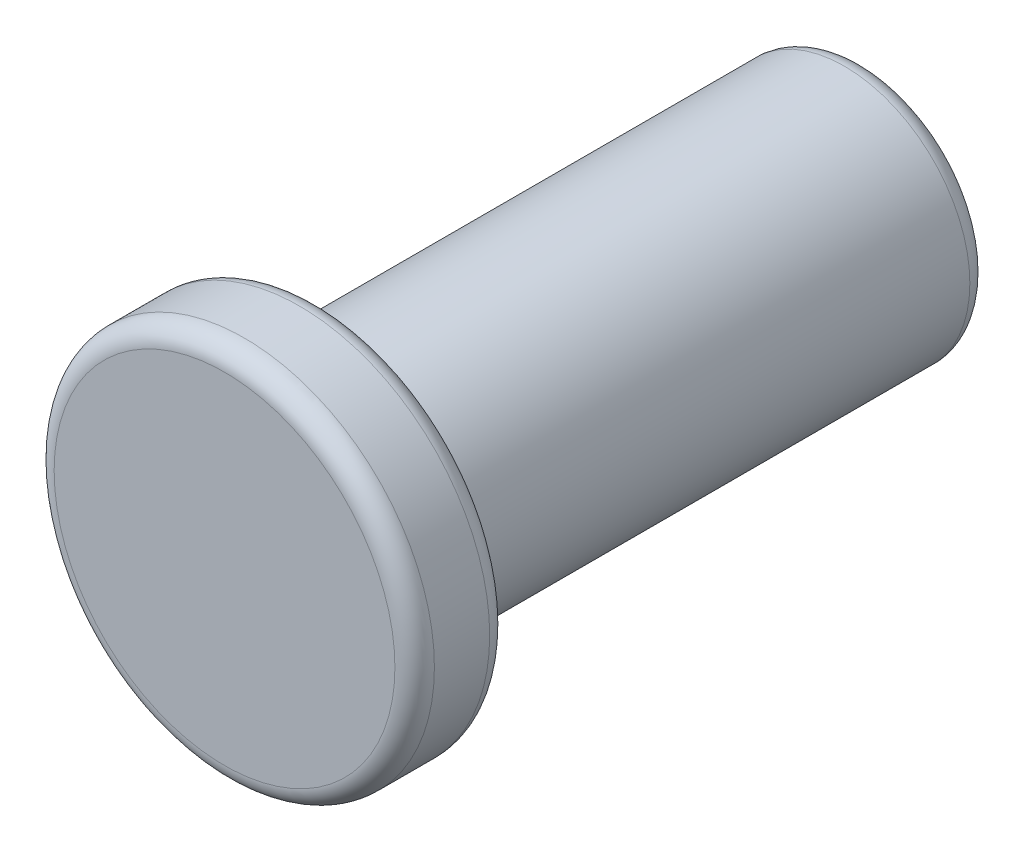
ISO-10303-21;
HEADER;
FILE_DESCRIPTION(('STEP AP214'),'2;1');
FILE_NAME('part.step','',(''),(''),'','','');
FILE_SCHEMA(('AUTOMOTIVE_DESIGN { 1 0 10303 214 1 1 1 1 }'));
ENDSEC;
DATA;
#1=APPLICATION_CONTEXT('core data for automotive mechanical design processes');
#2=APPLICATION_PROTOCOL_DEFINITION('international standard','automotive_design',2000,#1);
#3=PRODUCT_CONTEXT('',#1,'mechanical');
#4=PRODUCT('Part','Part','',(#3));
#5=PRODUCT_RELATED_PRODUCT_CATEGORY('part','',(#4));
#6=PRODUCT_DEFINITION_FORMATION('','',#4);
#7=PRODUCT_DEFINITION_CONTEXT('part definition',#1,'design');
#8=PRODUCT_DEFINITION('design','',#6,#7);
#9=PRODUCT_DEFINITION_SHAPE('','',#8);
#10=(LENGTH_UNIT() NAMED_UNIT(*) SI_UNIT(.MILLI.,.METRE.));
#11=(NAMED_UNIT(*) PLANE_ANGLE_UNIT() SI_UNIT($,.RADIAN.));
#12=(NAMED_UNIT(*) SI_UNIT($,.STERADIAN.) SOLID_ANGLE_UNIT());
#13=UNCERTAINTY_MEASURE_WITH_UNIT(LENGTH_MEASURE(1.E-05),#10,'distance_accuracy_value','');
#14=(GEOMETRIC_REPRESENTATION_CONTEXT(3) GLOBAL_UNCERTAINTY_ASSIGNED_CONTEXT((#13)) GLOBAL_UNIT_ASSIGNED_CONTEXT((#10,
#11,#12)) REPRESENTATION_CONTEXT('',''));
#15=CARTESIAN_POINT('',(0.,0.,0.));
#16=DIRECTION('',(0.,0.,1.));
#17=DIRECTION('',(1.,0.,0.));
#18=AXIS2_PLACEMENT_3D('',#15,#16,#17);
#19=CARTESIAN_POINT('',(0.,0.,0.));
#20=DIRECTION('',(0.,0.,1.));
#21=DIRECTION('',(1.,0.,0.));
#22=AXIS2_PLACEMENT_3D('',#19,#20,#21);
#23=PLANE('',#22);
#24=CARTESIAN_POINT('',(0.,0.,0.));
#25=DIRECTION('',(0.,0.,1.));
#26=DIRECTION('',(1.,0.,0.));
#27=AXIS2_PLACEMENT_3D('',#24,#25,#26);
#28=CIRCLE('',#27,4.31499999999996);
#29=CARTESIAN_POINT('',(4.31499999999996,0.,0.));
#30=VERTEX_POINT('',#29);
#31=EDGE_CURVE('E48',#30,#30,#28,.T.);
#32=ORIENTED_EDGE('',*,*,#31,.T.);
#33=EDGE_LOOP('',(#32));
#34=FACE_BOUND('',#33,.T.);
#35=ADVANCED_FACE('F37',(#34),#23,.T.);
#36=CARTESIAN_POINT('',(0.,0.,-335.576810525071));
#37=DIRECTION('',(0.,0.,-1.));
#38=DIRECTION('',(-1.,0.,0.));
#39=AXIS2_PLACEMENT_3D('',#36,#37,#38);
#40=CYLINDRICAL_SURFACE('',#39,4.81499999999996);
#41=CARTESIAN_POINT('',(0.,0.,-1.90000000000001));
#42=DIRECTION('',(0.,0.,-1.));
#43=DIRECTION('',(-1.,0.,0.));
#44=AXIS2_PLACEMENT_3D('',#41,#42,#43);
#45=CIRCLE('',#44,4.81499999999996);
#46=CARTESIAN_POINT('',(-4.81499999999996,0.,-1.90000000000001));
#47=VERTEX_POINT('',#46);
#48=EDGE_CURVE('E52',#47,#47,#45,.F.);
#49=ORIENTED_EDGE('',*,*,#48,.T.);
#50=EDGE_LOOP('',(#49));
#51=FACE_BOUND('',#50,.T.);
#52=CARTESIAN_POINT('',(0.,0.,-0.5));
#53=DIRECTION('',(0.,0.,1.));
#54=DIRECTION('',(1.,0.,0.));
#55=AXIS2_PLACEMENT_3D('',#52,#53,#54);
#56=CIRCLE('',#55,4.81499999999996);
#57=CARTESIAN_POINT('',(4.81499999999996,0.,-0.5));
#58=VERTEX_POINT('',#57);
#59=EDGE_CURVE('E57',#58,#58,#56,.F.);
#60=ORIENTED_EDGE('',*,*,#59,.T.);
#61=EDGE_LOOP('',(#60));
#62=FACE_BOUND('',#61,.T.);
#63=ADVANCED_FACE('F71',(#51,#62),#40,.T.);
#64=CARTESIAN_POINT('',(0.,4.81499999999996,-2.4));
#65=DIRECTION('',(0.,0.,-1.));
#66=DIRECTION('',(-1.,0.,0.));
#67=AXIS2_PLACEMENT_3D('',#64,#65,#66);
#68=PLANE('',#67);
#69=CARTESIAN_POINT('',(0.,0.,-2.4));
#70=DIRECTION('',(0.,0.,-1.));
#71=DIRECTION('',(-1.,0.,0.));
#72=AXIS2_PLACEMENT_3D('',#69,#70,#71);
#73=CIRCLE('',#72,4.31499999999996);
#74=CARTESIAN_POINT('',(-4.31499999999996,0.,-2.4));
#75=VERTEX_POINT('',#74);
#76=EDGE_CURVE('E60',#75,#75,#73,.T.);
#77=ORIENTED_EDGE('',*,*,#76,.T.);
#78=EDGE_LOOP('',(#77));
#79=FACE_BOUND('',#78,.T.);
#80=CARTESIAN_POINT('',(0.,0.,-2.40000000000001));
#81=DIRECTION('',(0.,0.,-1.));
#82=DIRECTION('',(-1.,0.,0.));
#83=AXIS2_PLACEMENT_3D('',#80,#81,#82);
#84=CIRCLE('',#83,3.17499999999996);
#85=CARTESIAN_POINT('',(-3.17499999999996,0.,-2.40000000000001));
#86=VERTEX_POINT('',#85);
#87=EDGE_CURVE('E63',#86,#86,#84,.T.);
#88=ORIENTED_EDGE('',*,*,#87,.F.);
#89=EDGE_LOOP('',(#88));
#90=FACE_BOUND('',#89,.T.);
#91=ADVANCED_FACE('F69',(#79,#90),#68,.T.);
#92=CARTESIAN_POINT('',(0.,0.,-335.576810525071));
#93=DIRECTION('',(0.,0.,-1.));
#94=DIRECTION('',(-1.,0.,0.));
#95=AXIS2_PLACEMENT_3D('',#92,#93,#94);
#96=CYLINDRICAL_SURFACE('',#95,3.17499999999996);
#97=CARTESIAN_POINT('',(0.,0.,-15.7));
#98=DIRECTION('',(0.,0.,1.));
#99=DIRECTION('',(1.,0.,0.));
#100=AXIS2_PLACEMENT_3D('',#97,#98,#99);
#101=CIRCLE('',#100,3.17499999999996);
#102=CARTESIAN_POINT('',(3.17499999999996,0.,-15.7));
#103=VERTEX_POINT('',#102);
#104=EDGE_CURVE('E10',#103,#103,#101,.T.);
#105=ORIENTED_EDGE('',*,*,#104,.T.);
#106=EDGE_LOOP('',(#105));
#107=FACE_BOUND('',#106,.T.);
#108=ORIENTED_EDGE('',*,*,#87,.T.);
#109=EDGE_LOOP('',(#108));
#110=FACE_BOUND('',#109,.T.);
#111=ADVANCED_FACE('F67',(#107,#110),#96,.T.);
#112=CARTESIAN_POINT('',(0.,0.,-1.90000000000001));
#113=DIRECTION('',(0.,0.,-1.));
#114=DIRECTION('',(-1.,0.,0.));
#115=AXIS2_PLACEMENT_3D('',#112,#113,#114);
#116=TOROIDAL_SURFACE('',#115,4.31499999999996,0.5);
#117=ORIENTED_EDGE('',*,*,#48,.F.);
#118=EDGE_LOOP('',(#117));
#119=FACE_BOUND('',#118,.T.);
#120=ORIENTED_EDGE('',*,*,#76,.F.);
#121=EDGE_LOOP('',(#120));
#122=FACE_BOUND('',#121,.T.);
#123=ADVANCED_FACE('F79',(#119,#122),#116,.T.);
#124=CARTESIAN_POINT('',(0.,0.,-0.5));
#125=DIRECTION('',(0.,0.,1.));
#126=DIRECTION('',(1.,0.,0.));
#127=AXIS2_PLACEMENT_3D('',#124,#125,#126);
#128=TOROIDAL_SURFACE('',#127,4.31499999999996,0.5);
#129=ORIENTED_EDGE('',*,*,#31,.F.);
#130=EDGE_LOOP('',(#129));
#131=FACE_BOUND('',#130,.T.);
#132=ORIENTED_EDGE('',*,*,#59,.F.);
#133=EDGE_LOOP('',(#132));
#134=FACE_BOUND('',#133,.T.);
#135=ADVANCED_FACE('F89',(#131,#134),#128,.T.);
#136=CARTESIAN_POINT('',(-4.81499999999996,-3.17499999999996,-16.2));
#137=DIRECTION('',(0.,0.,1.));
#138=DIRECTION('',(1.,0.,0.));
#139=AXIS2_PLACEMENT_3D('',#136,#137,#138);
#140=PLANE('',#139);
#141=CARTESIAN_POINT('',(0.,0.,-16.2));
#142=DIRECTION('',(0.,0.,1.));
#143=DIRECTION('',(1.,0.,0.));
#144=AXIS2_PLACEMENT_3D('',#141,#142,#143);
#145=CIRCLE('',#144,2.67499999999996);
#146=CARTESIAN_POINT('',(2.67499999999996,0.,-16.2));
#147=VERTEX_POINT('',#146);
#148=EDGE_CURVE('E44',#147,#147,#145,.F.);
#149=ORIENTED_EDGE('',*,*,#148,.T.);
#150=EDGE_LOOP('',(#149));
#151=FACE_BOUND('',#150,.T.);
#152=ADVANCED_FACE('F92',(#151),#140,.F.);
#153=CARTESIAN_POINT('',(0.,0.,-15.7));
#154=DIRECTION('',(0.,0.,1.));
#155=DIRECTION('',(1.,0.,0.));
#156=AXIS2_PLACEMENT_3D('',#153,#154,#155);
#157=TOROIDAL_SURFACE('',#156,2.67499999999996,0.5);
#158=ORIENTED_EDGE('',*,*,#104,.F.);
#159=EDGE_LOOP('',(#158));
#160=FACE_BOUND('',#159,.T.);
#161=ORIENTED_EDGE('',*,*,#148,.F.);
#162=EDGE_LOOP('',(#161));
#163=FACE_BOUND('',#162,.T.);
#164=ADVANCED_FACE('F39',(#160,#163),#157,.T.);
#165=CLOSED_SHELL('',(#35,#63,#91,#111,#123,#135,#152,#164));
#166=MANIFOLD_SOLID_BREP('B2',#165);
#167=ADVANCED_BREP_SHAPE_REPRESENTATION('',(#18,#166),#14);
#168=SHAPE_DEFINITION_REPRESENTATION(#9,#167);
ENDSEC;
END-ISO-10303-21;
